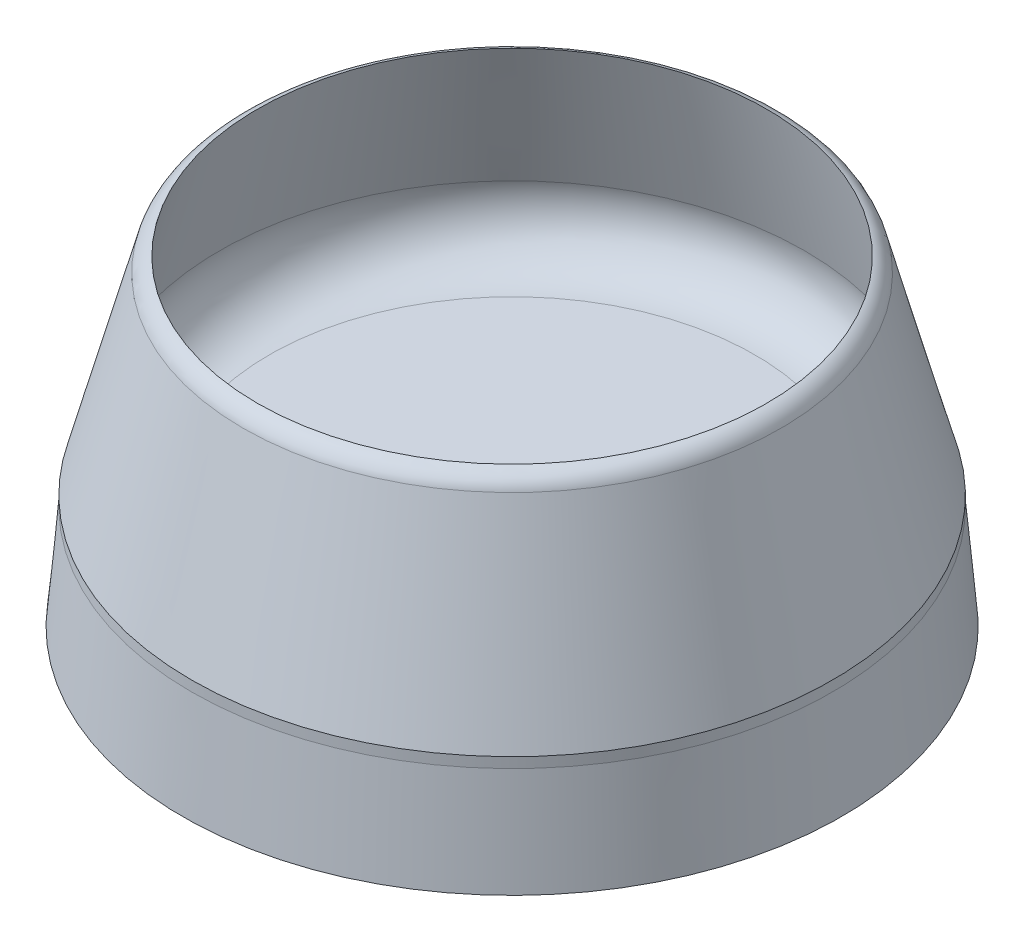
ISO-10303-21;
HEADER;
FILE_DESCRIPTION(('STEP AP214'),'2;1');
FILE_NAME('part.step','',(''),(''),'','','');
FILE_SCHEMA(('AUTOMOTIVE_DESIGN { 1 0 10303 214 1 1 1 1 }'));
ENDSEC;
DATA;
#1=APPLICATION_CONTEXT('core data for automotive mechanical design processes');
#2=APPLICATION_PROTOCOL_DEFINITION('international standard','automotive_design',2000,#1);
#3=PRODUCT_CONTEXT('',#1,'mechanical');
#4=PRODUCT('Part','Part','',(#3));
#5=PRODUCT_RELATED_PRODUCT_CATEGORY('part','',(#4));
#6=PRODUCT_DEFINITION_FORMATION('','',#4);
#7=PRODUCT_DEFINITION_CONTEXT('part definition',#1,'design');
#8=PRODUCT_DEFINITION('design','',#6,#7);
#9=PRODUCT_DEFINITION_SHAPE('','',#8);
#10=(LENGTH_UNIT() NAMED_UNIT(*) SI_UNIT(.MILLI.,.METRE.));
#11=(NAMED_UNIT(*) PLANE_ANGLE_UNIT() SI_UNIT($,.RADIAN.));
#12=(NAMED_UNIT(*) SI_UNIT($,.STERADIAN.) SOLID_ANGLE_UNIT());
#13=UNCERTAINTY_MEASURE_WITH_UNIT(LENGTH_MEASURE(1.E-05),#10,'distance_accuracy_value','');
#14=(GEOMETRIC_REPRESENTATION_CONTEXT(3) GLOBAL_UNCERTAINTY_ASSIGNED_CONTEXT((#13)) GLOBAL_UNIT_ASSIGNED_CONTEXT((#10,
#11,#12)) REPRESENTATION_CONTEXT('',''));
#15=CARTESIAN_POINT('',(0.,0.,0.));
#16=DIRECTION('',(0.,0.,1.));
#17=DIRECTION('',(1.,0.,0.));
#18=AXIS2_PLACEMENT_3D('',#15,#16,#17);
#19=CARTESIAN_POINT('',(0.,0.634999999999997,0.));
#20=DIRECTION('',(0.,-1.,0.));
#21=DIRECTION('',(0.,0.,-1.));
#22=AXIS2_PLACEMENT_3D('',#19,#20,#21);
#23=CYLINDRICAL_SURFACE('',#22,39.37);
#24=CARTESIAN_POINT('',(0.,0.634999999999997,0.));
#25=DIRECTION('',(0.,1.,0.));
#26=DIRECTION('',(0.,0.,1.));
#27=AXIS2_PLACEMENT_3D('',#24,#25,#26);
#28=CIRCLE('',#27,39.37);
#29=CARTESIAN_POINT('',(0.,0.634999999999997,39.37));
#30=VERTEX_POINT('',#29);
#31=EDGE_CURVE('E60',#30,#30,#28,.T.);
#32=ORIENTED_EDGE('',*,*,#31,.F.);
#33=EDGE_LOOP('',(#32));
#34=FACE_BOUND('',#33,.T.);
#35=CARTESIAN_POINT('',(0.,-0.634999999999997,0.));
#36=DIRECTION('',(0.,-1.,0.));
#37=DIRECTION('',(0.,0.,-1.));
#38=AXIS2_PLACEMENT_3D('',#35,#36,#37);
#39=CIRCLE('',#38,39.37);
#40=CARTESIAN_POINT('',(0.,-0.634999999999997,-39.37));
#41=VERTEX_POINT('',#40);
#42=EDGE_CURVE('E69',#41,#41,#39,.T.);
#43=ORIENTED_EDGE('',*,*,#42,.F.);
#44=EDGE_LOOP('',(#43));
#45=FACE_BOUND('',#44,.T.);
#46=ADVANCED_FACE('F34',(#34,#45),#23,.T.);
#47=CARTESIAN_POINT('',(0.,0.634999999999997,0.));
#48=DIRECTION('',(0.,-1.,0.));
#49=DIRECTION('',(0.,0.,1.));
#50=AXIS2_PLACEMENT_3D('',#47,#48,#49);
#51=CONICAL_SURFACE('',#50,39.37,0.261799387799149);
#52=CARTESIAN_POINT('',(0.,24.2524377512492,0.));
#53=DIRECTION('',(0.,1.,0.));
#54=DIRECTION('',(0.,0.,1.));
#55=AXIS2_PLACEMENT_3D('',#52,#53,#54);
#56=CIRCLE('',#55,33.0417266272605);
#57=CARTESIAN_POINT('',(0.,24.2524377512492,33.0417266272605));
#58=VERTEX_POINT('',#57);
#59=EDGE_CURVE('E49',#58,#58,#56,.F.);
#60=ORIENTED_EDGE('',*,*,#59,.T.);
#61=EDGE_LOOP('',(#60));
#62=FACE_BOUND('',#61,.T.);
#63=ORIENTED_EDGE('',*,*,#31,.T.);
#64=EDGE_LOOP('',(#63));
#65=FACE_BOUND('',#64,.T.);
#66=ADVANCED_FACE('F109',(#62,#65),#51,.T.);
#67=CARTESIAN_POINT('',(0.,26.035,0.));
#68=DIRECTION('',(0.,-1.,0.));
#69=DIRECTION('',(0.,0.,1.));
#70=AXIS2_PLACEMENT_3D('',#67,#68,#69);
#71=CONICAL_SURFACE('',#70,31.2940954,0.261799387799149);
#72=CARTESIAN_POINT('',(0.,8.628500936401,0.));
#73=DIRECTION('',(0.,1.,0.));
#74=DIRECTION('',(0.,0.,1.));
#75=AXIS2_PLACEMENT_3D('',#72,#73,#74);
#76=CIRCLE('',#75,35.9581527671444);
#77=CARTESIAN_POINT('',(0.,8.628500936401,35.9581527671444));
#78=VERTEX_POINT('',#77);
#79=EDGE_CURVE('E54',#78,#78,#76,.F.);
#80=ORIENTED_EDGE('',*,*,#79,.T.);
#81=EDGE_LOOP('',(#80));
#82=FACE_BOUND('',#81,.T.);
#83=CARTESIAN_POINT('',(0.,26.035,0.));
#84=DIRECTION('',(0.,1.,0.));
#85=DIRECTION('',(0.,0.,1.));
#86=AXIS2_PLACEMENT_3D('',#83,#84,#85);
#87=CIRCLE('',#86,31.2940954);
#88=CARTESIAN_POINT('',(0.,26.035,31.2940954));
#89=VERTEX_POINT('',#88);
#90=EDGE_CURVE('E63',#89,#89,#87,.T.);
#91=ORIENTED_EDGE('',*,*,#90,.T.);
#92=EDGE_LOOP('',(#91));
#93=FACE_BOUND('',#92,.T.);
#94=ADVANCED_FACE('F115',(#82,#93),#71,.F.);
#95=CARTESIAN_POINT('',(0.,0.634999999999997,0.));
#96=DIRECTION('',(0.,1.,0.));
#97=DIRECTION('',(0.,0.,1.));
#98=AXIS2_PLACEMENT_3D('',#95,#96,#97);
#99=PLANE('',#98);
#100=CARTESIAN_POINT('',(0.,0.634999999999997,0.));
#101=DIRECTION('',(0.,1.,0.));
#102=DIRECTION('',(0.,0.,1.));
#103=AXIS2_PLACEMENT_3D('',#100,#101,#102);
#104=CIRCLE('',#103,29.8245237702089);
#105=CARTESIAN_POINT('',(0.,0.634999999999997,29.8245237702089));
#106=VERTEX_POINT('',#105);
#107=EDGE_CURVE('E57',#106,#106,#104,.T.);
#108=ORIENTED_EDGE('',*,*,#107,.T.);
#109=EDGE_LOOP('',(#108));
#110=FACE_BOUND('',#109,.T.);
#111=ADVANCED_FACE('F146',(#110),#99,.T.);
#112=CARTESIAN_POINT('',(0.,-0.634999999999997,0.));
#113=DIRECTION('',(0.,-1.,0.));
#114=DIRECTION('',(0.,0.,-1.));
#115=AXIS2_PLACEMENT_3D('',#112,#113,#114);
#116=CONICAL_SURFACE('',#115,39.37,0.0872664625997167);
#117=CARTESIAN_POINT('',(0.,-13.335,0.));
#118=DIRECTION('',(0.,-1.,0.));
#119=DIRECTION('',(0.,0.,-1.));
#120=AXIS2_PLACEMENT_3D('',#117,#118,#119);
#121=CIRCLE('',#120,40.4811060267792);
#122=CARTESIAN_POINT('',(0.,-13.335,-40.4811060267792));
#123=VERTEX_POINT('',#122);
#124=EDGE_CURVE('E66',#123,#123,#121,.T.);
#125=ORIENTED_EDGE('',*,*,#124,.F.);
#126=EDGE_LOOP('',(#125));
#127=FACE_BOUND('',#126,.T.);
#128=ORIENTED_EDGE('',*,*,#42,.T.);
#129=EDGE_LOOP('',(#128));
#130=FACE_BOUND('',#129,.T.);
#131=ADVANCED_FACE('F143',(#127,#130),#116,.T.);
#132=CARTESIAN_POINT('',(0.,-13.335,0.));
#133=DIRECTION('',(0.,-1.,0.));
#134=DIRECTION('',(0.,0.,-1.));
#135=AXIS2_PLACEMENT_3D('',#132,#133,#134);
#136=CONICAL_SURFACE('',#135,39.211105982,0.0872664625997167);
#137=CARTESIAN_POINT('',(0.,-11.2567192079605,0.));
#138=DIRECTION('',(0.,1.,0.));
#139=DIRECTION('',(0.,0.,1.));
#140=AXIS2_PLACEMENT_3D('',#137,#138,#139);
#141=CIRCLE('',#140,39.0292799730729);
#142=CARTESIAN_POINT('',(0.,-11.2567192079605,39.0292799730729));
#143=VERTEX_POINT('',#142);
#144=EDGE_CURVE('E10',#143,#143,#141,.F.);
#145=ORIENTED_EDGE('',*,*,#144,.T.);
#146=EDGE_LOOP('',(#145));
#147=FACE_BOUND('',#146,.T.);
#148=CARTESIAN_POINT('',(0.,-6.43156103355236,0.));
#149=DIRECTION('',(0.,1.,0.));
#150=DIRECTION('',(0.,0.,1.));
#151=AXIS2_PLACEMENT_3D('',#148,#149,#150);
#152=CIRCLE('',#151,38.6071333330927);
#153=CARTESIAN_POINT('',(0.,-6.43156103355236,38.6071333330927));
#154=VERTEX_POINT('',#153);
#155=EDGE_CURVE('E41',#154,#154,#152,.T.);
#156=ORIENTED_EDGE('',*,*,#155,.T.);
#157=EDGE_LOOP('',(#156));
#158=FACE_BOUND('',#157,.T.);
#159=ADVANCED_FACE('F97',(#147,#158),#136,.F.);
#160=CARTESIAN_POINT('',(0.,-0.634999999999997,0.));
#161=DIRECTION('',(0.,-1.,0.));
#162=DIRECTION('',(0.,0.,-1.));
#163=AXIS2_PLACEMENT_3D('',#160,#161,#162);
#164=PLANE('',#163);
#165=CARTESIAN_POINT('',(0.,-0.634999999999997,0.));
#166=DIRECTION('',(0.,-1.,0.));
#167=DIRECTION('',(0.,0.,-1.));
#168=AXIS2_PLACEMENT_3D('',#165,#166,#167);
#169=CIRCLE('',#168,32.2812970002101);
#170=CARTESIAN_POINT('',(0.,-0.634999999999997,-32.2812970002101));
#171=VERTEX_POINT('',#170);
#172=EDGE_CURVE('E45',#171,#171,#169,.T.);
#173=ORIENTED_EDGE('',*,*,#172,.T.);
#174=EDGE_LOOP('',(#173));
#175=FACE_BOUND('',#174,.T.);
#176=CARTESIAN_POINT('',(0.,-0.634999999999997,-9.525));
#177=DIRECTION('',(0.,-1.,0.));
#178=DIRECTION('',(0.,0.,-1.));
#179=AXIS2_PLACEMENT_3D('',#176,#177,#178);
#180=CIRCLE('',#179,1.5875);
#181=CARTESIAN_POINT('',(0.,-0.634999999999997,-11.1125));
#182=VERTEX_POINT('',#181);
#183=EDGE_CURVE('E79',#182,#182,#180,.T.);
#184=ORIENTED_EDGE('',*,*,#183,.F.);
#185=EDGE_LOOP('',(#184));
#186=FACE_BOUND('',#185,.T.);
#187=CARTESIAN_POINT('',(0.,-0.634999999999997,9.525));
#188=DIRECTION('',(0.,-1.,0.));
#189=DIRECTION('',(0.,0.,-1.));
#190=AXIS2_PLACEMENT_3D('',#187,#188,#189);
#191=CIRCLE('',#190,1.5875);
#192=CARTESIAN_POINT('',(0.,-0.634999999999993,11.1125));
#193=VERTEX_POINT('',#192);
#194=EDGE_CURVE('E73',#193,#193,#191,.T.);
#195=ORIENTED_EDGE('',*,*,#194,.F.);
#196=EDGE_LOOP('',(#195));
#197=FACE_BOUND('',#196,.T.);
#198=ADVANCED_FACE('F94',(#175,#186,#197),#164,.T.);
#199=CARTESIAN_POINT('',(0.,-19.685,9.525));
#200=DIRECTION('',(0.,1.,0.));
#201=DIRECTION('',(0.,0.,1.));
#202=AXIS2_PLACEMENT_3D('',#199,#200,#201);
#203=CYLINDRICAL_SURFACE('',#202,1.5875);
#204=CARTESIAN_POINT('',(0.,-19.685,9.525));
#205=DIRECTION('',(0.,-1.,0.));
#206=DIRECTION('',(0.,0.,-1.));
#207=AXIS2_PLACEMENT_3D('',#204,#205,#206);
#208=CIRCLE('',#207,1.5875);
#209=CARTESIAN_POINT('',(0.,-19.685,11.1125));
#210=VERTEX_POINT('',#209);
#211=EDGE_CURVE('E72',#210,#210,#208,.T.);
#212=CARTESIAN_POINT('',(0.,-19.685,11.1125));
#213=CARTESIAN_POINT('',(0.,-19.4865625,11.1125));
#214=CARTESIAN_POINT('',(0.,-19.288125,11.1125));
#215=CARTESIAN_POINT('',(0.,-18.89125,11.1125));
#216=CARTESIAN_POINT('',(0.,-18.6928125,11.1125));
#217=CARTESIAN_POINT('',(0.,-18.2959375,11.1125));
#218=CARTESIAN_POINT('',(0.,-18.0975,11.1125));
#219=CARTESIAN_POINT('',(0.,-17.700625,11.1125));
#220=CARTESIAN_POINT('',(0.,-17.5021875,11.1125));
#221=CARTESIAN_POINT('',(0.,-17.1053125,11.1125));
#222=CARTESIAN_POINT('',(0.,-16.906875,11.1125));
#223=CARTESIAN_POINT('',(0.,-16.51,11.1125));
#224=CARTESIAN_POINT('',(0.,-16.3115625,11.1125));
#225=CARTESIAN_POINT('',(0.,-15.9146875,11.1125));
#226=CARTESIAN_POINT('',(0.,-15.71625,11.1125));
#227=CARTESIAN_POINT('',(0.,-15.319375,11.1125));
#228=CARTESIAN_POINT('',(0.,-15.1209375,11.1125));
#229=CARTESIAN_POINT('',(0.,-14.7240625,11.1125));
#230=CARTESIAN_POINT('',(0.,-14.525625,11.1125));
#231=CARTESIAN_POINT('',(0.,-14.12875,11.1125));
#232=CARTESIAN_POINT('',(0.,-13.9303125,11.1125));
#233=CARTESIAN_POINT('',(0.,-13.5334375,11.1125));
#234=CARTESIAN_POINT('',(0.,-13.335,11.1125));
#235=CARTESIAN_POINT('',(0.,-12.938125,11.1125));
#236=CARTESIAN_POINT('',(0.,-12.7396875,11.1125));
#237=CARTESIAN_POINT('',(0.,-12.3428125,11.1125));
#238=CARTESIAN_POINT('',(0.,-12.144375,11.1125));
#239=CARTESIAN_POINT('',(0.,-11.7475,11.1125));
#240=CARTESIAN_POINT('',(0.,-11.5490625,11.1125));
#241=CARTESIAN_POINT('',(0.,-11.1521875,11.1125));
#242=CARTESIAN_POINT('',(0.,-10.95375,11.1125));
#243=CARTESIAN_POINT('',(0.,-10.556875,11.1125));
#244=CARTESIAN_POINT('',(0.,-10.3584375,11.1125));
#245=CARTESIAN_POINT('',(0.,-9.96156249999999,11.1125));
#246=CARTESIAN_POINT('',(0.,-9.76312499999999,11.1125));
#247=CARTESIAN_POINT('',(0.,-9.36624999999999,11.1125));
#248=CARTESIAN_POINT('',(0.,-9.16781249999999,11.1125));
#249=CARTESIAN_POINT('',(0.,-8.77093749999999,11.1125));
#250=CARTESIAN_POINT('',(0.,-8.57249999999999,11.1125));
#251=CARTESIAN_POINT('',(0.,-8.17562499999999,11.1125));
#252=CARTESIAN_POINT('',(0.,-7.97718749999999,11.1125));
#253=CARTESIAN_POINT('',(0.,-7.58031249999999,11.1125));
#254=CARTESIAN_POINT('',(0.,-7.38187499999999,11.1125));
#255=CARTESIAN_POINT('',(0.,-6.98499999999999,11.1125));
#256=CARTESIAN_POINT('',(0.,-6.78656249999999,11.1125));
#257=CARTESIAN_POINT('',(0.,-6.38968749999999,11.1125));
#258=CARTESIAN_POINT('',(0.,-6.19124999999999,11.1125));
#259=CARTESIAN_POINT('',(0.,-5.79437499999999,11.1125));
#260=CARTESIAN_POINT('',(0.,-5.59593749999999,11.1125));
#261=CARTESIAN_POINT('',(0.,-5.19906249999999,11.1125));
#262=CARTESIAN_POINT('',(0.,-5.00062499999999,11.1125));
#263=CARTESIAN_POINT('',(0.,-4.60374999999999,11.1125));
#264=CARTESIAN_POINT('',(0.,-4.40531249999999,11.1125));
#265=CARTESIAN_POINT('',(0.,-4.00843749999999,11.1125));
#266=CARTESIAN_POINT('',(0.,-3.80999999999999,11.1125));
#267=CARTESIAN_POINT('',(0.,-3.41312499999999,11.1125));
#268=CARTESIAN_POINT('',(0.,-3.21468749999999,11.1125));
#269=CARTESIAN_POINT('',(0.,-2.81781249999999,11.1125));
#270=CARTESIAN_POINT('',(0.,-2.61937499999999,11.1125));
#271=CARTESIAN_POINT('',(0.,-2.22249999999999,11.1125));
#272=CARTESIAN_POINT('',(0.,-2.02406249999999,11.1125));
#273=CARTESIAN_POINT('',(0.,-1.62718749999999,11.1125));
#274=CARTESIAN_POINT('',(0.,-1.42874999999999,11.1125));
#275=CARTESIAN_POINT('',(0.,-1.03187499999999,11.1125));
#276=CARTESIAN_POINT('',(0.,-0.833437499999993,11.1125));
#277=CARTESIAN_POINT('',(0.,-0.634999999999993,11.1125));
#278=B_SPLINE_CURVE_WITH_KNOTS('',3,(#212,#213,#214,#215,#216,#217,#218,#219,#220,#221,#222,
#223,#224,#225,#226,#227,#228,#229,#230,#231,#232,#233,#234,#235,#236,#237,#238,#239,#240,#241,
#242,#243,#244,#245,#246,#247,#248,#249,#250,#251,#252,#253,#254,#255,#256,#257,#258,#259,#260,
#261,#262,#263,#264,#265,#266,#267,#268,#269,#270,#271,#272,#273,#274,#275,#276,#277),
.UNSPECIFIED.,.F.,.F.,(4,2,2,2,2,2,2,2,2,2,2,2,2,2,2,2,2,2,2,2,2,2,2,2,2,2,2,2,2,2,2,2,4),(0.,
0.595312499999997,1.190625,1.7859375,2.38125,2.9765625,3.571875,4.1671875,4.7625,5.3578125,
5.953125,6.5484375,7.14375,7.7390625,8.334375,8.9296875,9.525,10.1203125,10.715625,11.3109375,
11.90625,12.5015625,13.096875,13.6921875,14.2875,14.8828125,15.478125,16.0734375,16.66875,
17.2640625,17.859375,18.4546875,19.05),.UNSPECIFIED.);
#279=EDGE_CURVE('BSEAM90',#210,#193,#278,.T.);
#280=ORIENTED_EDGE('',*,*,#211,.F.);
#281=ORIENTED_EDGE('',*,*,#194,.T.);
#282=ORIENTED_EDGE('',*,*,#279,.T.);
#283=ORIENTED_EDGE('',*,*,#279,.F.);
#284=EDGE_LOOP('',(#280,#282,#281,#283));
#285=FACE_BOUND('',#284,.T.);
#286=ADVANCED_FACE('F90',(#285),#203,.T.);
#287=CARTESIAN_POINT('',(0.,-19.685,-9.525));
#288=DIRECTION('',(0.,1.,0.));
#289=DIRECTION('',(0.,0.,1.));
#290=AXIS2_PLACEMENT_3D('',#287,#288,#289);
#291=CYLINDRICAL_SURFACE('',#290,1.5875);
#292=CARTESIAN_POINT('',(0.,-19.685,-9.525));
#293=DIRECTION('',(0.,-1.,0.));
#294=DIRECTION('',(0.,0.,-1.));
#295=AXIS2_PLACEMENT_3D('',#292,#293,#294);
#296=CIRCLE('',#295,1.5875);
#297=CARTESIAN_POINT('',(0.,-19.685,-11.1125));
#298=VERTEX_POINT('',#297);
#299=EDGE_CURVE('E76',#298,#298,#296,.T.);
#300=ORIENTED_EDGE('',*,*,#299,.F.);
#301=EDGE_LOOP('',(#300));
#302=FACE_BOUND('',#301,.T.);
#303=ORIENTED_EDGE('',*,*,#183,.T.);
#304=EDGE_LOOP('',(#303));
#305=FACE_BOUND('',#304,.T.);
#306=ADVANCED_FACE('F87',(#302,#305),#291,.T.);
#307=CARTESIAN_POINT('',(0.,-19.685,0.));
#308=DIRECTION('',(1.,0.,0.));
#309=DIRECTION('',(0.,0.,-1.));
#310=AXIS2_PLACEMENT_3D('',#307,#308,#309);
#311=TOROIDAL_SURFACE('',#310,9.525,1.5875);
#312=CARTESIAN_POINT('',(0.,-19.685,0.));
#313=DIRECTION('',(1.,0.,0.));
#314=DIRECTION('',(0.,0.,-1.));
#315=AXIS2_PLACEMENT_3D('',#312,#313,#314);
#316=CIRCLE('',#315,11.1125);
#317=EDGE_CURVE('',#210,#298,#316,.T.);
#318=ORIENTED_EDGE('',*,*,#211,.T.);
#319=ORIENTED_EDGE('',*,*,#299,.T.);
#320=ORIENTED_EDGE('',*,*,#317,.T.);
#321=ORIENTED_EDGE('',*,*,#317,.F.);
#322=EDGE_LOOP('',(#318,#320,#319,#321));
#323=FACE_BOUND('',#322,.T.);
#324=ADVANCED_FACE('F85',(#323),#311,.T.);
#325=CARTESIAN_POINT('',(0.,6.985,0.));
#326=DIRECTION('',(0.,1.,0.));
#327=DIRECTION('',(0.,0.,1.));
#328=AXIS2_PLACEMENT_3D('',#325,#326,#327);
#329=TOROIDAL_SURFACE('',#328,29.8245237702089,6.35);
#330=ORIENTED_EDGE('',*,*,#79,.F.);
#331=EDGE_LOOP('',(#330));
#332=FACE_BOUND('',#331,.T.);
#333=ORIENTED_EDGE('',*,*,#107,.F.);
#334=EDGE_LOOP('',(#333));
#335=FACE_BOUND('',#334,.T.);
#336=ADVANCED_FACE('F122',(#332,#335),#329,.F.);
#337=CARTESIAN_POINT('',(0.,23.5950373766888,0.));
#338=DIRECTION('',(0.,1.,0.));
#339=DIRECTION('',(0.,0.,1.));
#340=AXIS2_PLACEMENT_3D('',#337,#338,#339);
#341=TOROIDAL_SURFACE('',#340,30.5882750284862,2.54);
#342=ORIENTED_EDGE('',*,*,#59,.F.);
#343=EDGE_LOOP('',(#342));
#344=FACE_BOUND('',#343,.T.);
#345=ORIENTED_EDGE('',*,*,#90,.F.);
#346=EDGE_LOOP('',(#345));
#347=FACE_BOUND('',#346,.T.);
#348=ADVANCED_FACE('F125',(#344,#347),#341,.T.);
#349=CARTESIAN_POINT('',(0.,-6.985,0.));
#350=DIRECTION('',(0.,-1.,0.));
#351=DIRECTION('',(0.,0.,-1.));
#352=AXIS2_PLACEMENT_3D('',#349,#350,#351);
#353=TOROIDAL_SURFACE('',#352,32.2812970002101,6.35);
#354=ORIENTED_EDGE('',*,*,#155,.F.);
#355=EDGE_LOOP('',(#354));
#356=FACE_BOUND('',#355,.T.);
#357=ORIENTED_EDGE('',*,*,#172,.F.);
#358=EDGE_LOOP('',(#357));
#359=FACE_BOUND('',#358,.T.);
#360=ADVANCED_FACE('F128',(#356,#359),#353,.F.);
#361=CARTESIAN_POINT('',(0.,-11.0353436213814,0.));
#362=DIRECTION('',(0.,-1.,0.));
#363=DIRECTION('',(0.,0.,-1.));
#364=AXIS2_PLACEMENT_3D('',#361,#362,#363);
#365=TOROIDAL_SURFACE('',#364,41.5596145062259,2.54);
#366=ORIENTED_EDGE('',*,*,#124,.T.);
#367=EDGE_LOOP('',(#366));
#368=FACE_BOUND('',#367,.T.);
#369=ORIENTED_EDGE('',*,*,#144,.F.);
#370=EDGE_LOOP('',(#369));
#371=FACE_BOUND('',#370,.T.);
#372=ADVANCED_FACE('F36',(#368,#371),#365,.T.);
#373=CLOSED_SHELL('',(#46,#66,#94,#111,#131,#159,#198,#286,#306,#324,#336,#348,#360,#372));
#374=MANIFOLD_SOLID_BREP('B2',#373);
#375=ADVANCED_BREP_SHAPE_REPRESENTATION('',(#18,#374),#14);
#376=SHAPE_DEFINITION_REPRESENTATION(#9,#375);
ENDSEC;
END-ISO-10303-21;
